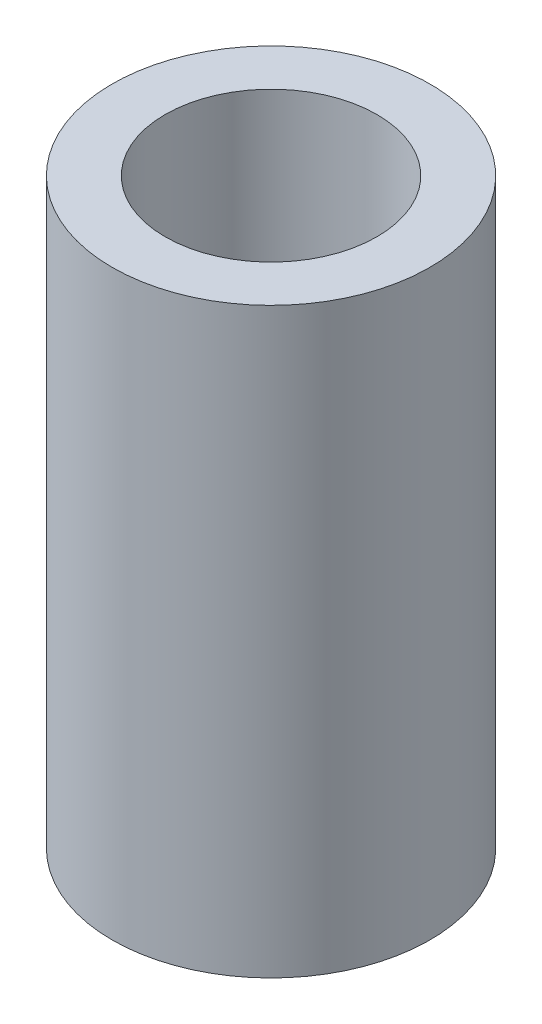
ISO-10303-21;
HEADER;
FILE_DESCRIPTION(('STEP AP214'),'2;1');
FILE_NAME('part.step','',(''),(''),'','','');
FILE_SCHEMA(('AUTOMOTIVE_DESIGN { 1 0 10303 214 1 1 1 1 }'));
ENDSEC;
DATA;
#1=APPLICATION_CONTEXT('core data for automotive mechanical design processes');
#2=APPLICATION_PROTOCOL_DEFINITION('international standard','automotive_design',2000,#1);
#3=PRODUCT_CONTEXT('',#1,'mechanical');
#4=PRODUCT('Part','Part','',(#3));
#5=PRODUCT_RELATED_PRODUCT_CATEGORY('part','',(#4));
#6=PRODUCT_DEFINITION_FORMATION('','',#4);
#7=PRODUCT_DEFINITION_CONTEXT('part definition',#1,'design');
#8=PRODUCT_DEFINITION('design','',#6,#7);
#9=PRODUCT_DEFINITION_SHAPE('','',#8);
#10=(LENGTH_UNIT() NAMED_UNIT(*) SI_UNIT(.MILLI.,.METRE.));
#11=(NAMED_UNIT(*) PLANE_ANGLE_UNIT() SI_UNIT($,.RADIAN.));
#12=(NAMED_UNIT(*) SI_UNIT($,.STERADIAN.) SOLID_ANGLE_UNIT());
#13=UNCERTAINTY_MEASURE_WITH_UNIT(LENGTH_MEASURE(1.E-05),#10,'distance_accuracy_value','');
#14=(GEOMETRIC_REPRESENTATION_CONTEXT(3) GLOBAL_UNCERTAINTY_ASSIGNED_CONTEXT((#13)) GLOBAL_UNIT_ASSIGNED_CONTEXT((#10,
#11,#12)) REPRESENTATION_CONTEXT('',''));
#15=CARTESIAN_POINT('',(0.,0.,0.));
#16=DIRECTION('',(0.,0.,1.));
#17=DIRECTION('',(1.,0.,0.));
#18=AXIS2_PLACEMENT_3D('',#15,#16,#17);
#19=CARTESIAN_POINT('',(0.,0.,0.));
#20=DIRECTION('',(0.,1.,0.));
#21=DIRECTION('',(0.,0.,1.));
#22=AXIS2_PLACEMENT_3D('',#19,#20,#21);
#23=CYLINDRICAL_SURFACE('',#22,2.);
#24=CARTESIAN_POINT('',(0.,0.,0.));
#25=DIRECTION('',(0.,1.,0.));
#26=DIRECTION('',(0.,0.,1.));
#27=AXIS2_PLACEMENT_3D('',#24,#25,#26);
#28=CIRCLE('',#27,2.);
#29=CARTESIAN_POINT('',(0.,0.,2.));
#30=VERTEX_POINT('',#29);
#31=EDGE_CURVE('E10',#30,#30,#28,.T.);
#32=ORIENTED_EDGE('',*,*,#31,.T.);
#33=EDGE_LOOP('',(#32));
#34=FACE_BOUND('',#33,.T.);
#35=CARTESIAN_POINT('',(0.,-11.,0.));
#36=DIRECTION('',(0.,1.,0.));
#37=DIRECTION('',(0.,0.,1.));
#38=AXIS2_PLACEMENT_3D('',#35,#36,#37);
#39=CIRCLE('',#38,2.);
#40=CARTESIAN_POINT('',(0.,-11.,2.));
#41=VERTEX_POINT('',#40);
#42=EDGE_CURVE('E58',#41,#41,#39,.T.);
#43=ORIENTED_EDGE('',*,*,#42,.F.);
#44=EDGE_LOOP('',(#43));
#45=FACE_BOUND('',#44,.T.);
#46=ADVANCED_FACE('F41',(#34,#45),#23,.F.);
#47=CARTESIAN_POINT('',(-2.,0.,0.));
#48=DIRECTION('',(0.,1.,0.));
#49=DIRECTION('',(0.,0.,1.));
#50=AXIS2_PLACEMENT_3D('',#47,#48,#49);
#51=PLANE('',#50);
#52=CARTESIAN_POINT('',(0.,0.,0.));
#53=DIRECTION('',(0.,1.,0.));
#54=DIRECTION('',(0.,0.,1.));
#55=AXIS2_PLACEMENT_3D('',#52,#53,#54);
#56=CIRCLE('',#55,3.);
#57=CARTESIAN_POINT('',(0.,0.,3.));
#58=VERTEX_POINT('',#57);
#59=EDGE_CURVE('E48',#58,#58,#56,.T.);
#60=ORIENTED_EDGE('',*,*,#59,.T.);
#61=EDGE_LOOP('',(#60));
#62=FACE_BOUND('',#61,.T.);
#63=ORIENTED_EDGE('',*,*,#31,.F.);
#64=EDGE_LOOP('',(#63));
#65=FACE_BOUND('',#64,.T.);
#66=ADVANCED_FACE('F69',(#62,#65),#51,.T.);
#67=CARTESIAN_POINT('',(0.,0.,0.));
#68=DIRECTION('',(0.,1.,0.));
#69=DIRECTION('',(0.,0.,1.));
#70=AXIS2_PLACEMENT_3D('',#67,#68,#69);
#71=CYLINDRICAL_SURFACE('',#70,3.);
#72=CARTESIAN_POINT('',(0.,-11.,0.));
#73=DIRECTION('',(0.,1.,0.));
#74=DIRECTION('',(0.,0.,1.));
#75=AXIS2_PLACEMENT_3D('',#72,#73,#74);
#76=CIRCLE('',#75,3.);
#77=CARTESIAN_POINT('',(0.,-11.,3.));
#78=VERTEX_POINT('',#77);
#79=EDGE_CURVE('E53',#78,#78,#76,.T.);
#80=ORIENTED_EDGE('',*,*,#79,.T.);
#81=EDGE_LOOP('',(#80));
#82=FACE_BOUND('',#81,.T.);
#83=ORIENTED_EDGE('',*,*,#59,.F.);
#84=EDGE_LOOP('',(#83));
#85=FACE_BOUND('',#84,.T.);
#86=ADVANCED_FACE('F73',(#82,#85),#71,.T.);
#87=CARTESIAN_POINT('',(-3.,-11.,0.));
#88=DIRECTION('',(0.,-1.,0.));
#89=DIRECTION('',(0.,0.,-1.));
#90=AXIS2_PLACEMENT_3D('',#87,#88,#89);
#91=PLANE('',#90);
#92=ORIENTED_EDGE('',*,*,#42,.T.);
#93=EDGE_LOOP('',(#92));
#94=FACE_BOUND('',#93,.T.);
#95=ORIENTED_EDGE('',*,*,#79,.F.);
#96=EDGE_LOOP('',(#95));
#97=FACE_BOUND('',#96,.T.);
#98=ADVANCED_FACE('F65',(#94,#97),#91,.T.);
#99=CLOSED_SHELL('',(#46,#66,#86,#98));
#100=MANIFOLD_SOLID_BREP('B2',#99);
#101=ADVANCED_BREP_SHAPE_REPRESENTATION('',(#18,#100),#14);
#102=SHAPE_DEFINITION_REPRESENTATION(#9,#101);
ENDSEC;
END-ISO-10303-21;
